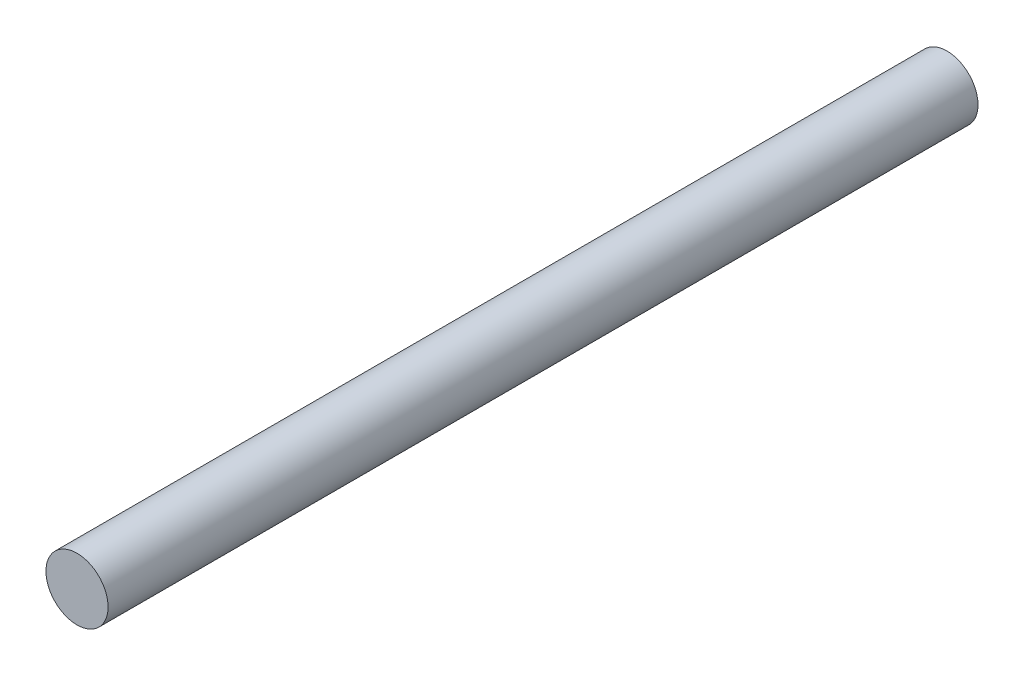
ISO-10303-21;
HEADER;
FILE_DESCRIPTION(('STEP AP214'),'2;1');
FILE_NAME('part.step','',(''),(''),'','','');
FILE_SCHEMA(('AUTOMOTIVE_DESIGN { 1 0 10303 214 1 1 1 1 }'));
ENDSEC;
DATA;
#1=APPLICATION_CONTEXT('core data for automotive mechanical design processes');
#2=APPLICATION_PROTOCOL_DEFINITION('international standard','automotive_design',2000,#1);
#3=PRODUCT_CONTEXT('',#1,'mechanical');
#4=PRODUCT('Part','Part','',(#3));
#5=PRODUCT_RELATED_PRODUCT_CATEGORY('part','',(#4));
#6=PRODUCT_DEFINITION_FORMATION('','',#4);
#7=PRODUCT_DEFINITION_CONTEXT('part definition',#1,'design');
#8=PRODUCT_DEFINITION('design','',#6,#7);
#9=PRODUCT_DEFINITION_SHAPE('','',#8);
#10=(LENGTH_UNIT() NAMED_UNIT(*) SI_UNIT(.MILLI.,.METRE.));
#11=(NAMED_UNIT(*) PLANE_ANGLE_UNIT() SI_UNIT($,.RADIAN.));
#12=(NAMED_UNIT(*) SI_UNIT($,.STERADIAN.) SOLID_ANGLE_UNIT());
#13=UNCERTAINTY_MEASURE_WITH_UNIT(LENGTH_MEASURE(1.E-05),#10,'distance_accuracy_value','');
#14=(GEOMETRIC_REPRESENTATION_CONTEXT(3) GLOBAL_UNCERTAINTY_ASSIGNED_CONTEXT((#13)) GLOBAL_UNIT_ASSIGNED_CONTEXT((#10,
#11,#12)) REPRESENTATION_CONTEXT('',''));
#15=CARTESIAN_POINT('',(0.,0.,0.));
#16=DIRECTION('',(0.,0.,1.));
#17=DIRECTION('',(1.,0.,0.));
#18=AXIS2_PLACEMENT_3D('',#15,#16,#17);
#19=CARTESIAN_POINT('',(0.,0.,355.6));
#20=DIRECTION('',(0.,0.,-1.));
#21=DIRECTION('',(-1.,0.,0.));
#22=AXIS2_PLACEMENT_3D('',#19,#20,#21);
#23=CYLINDRICAL_SURFACE('',#22,12.7);
#24=CARTESIAN_POINT('',(0.,0.,355.6));
#25=DIRECTION('',(0.,0.,1.));
#26=DIRECTION('',(1.,0.,0.));
#27=AXIS2_PLACEMENT_3D('',#24,#25,#26);
#28=CIRCLE('',#27,12.7);
#29=CARTESIAN_POINT('',(12.7,0.,355.6));
#30=VERTEX_POINT('',#29);
#31=EDGE_CURVE('E10',#30,#30,#28,.T.);
#32=ORIENTED_EDGE('',*,*,#31,.F.);
#33=EDGE_LOOP('',(#32));
#34=FACE_BOUND('',#33,.T.);
#35=CARTESIAN_POINT('',(0.,0.,0.));
#36=DIRECTION('',(0.,0.,1.));
#37=DIRECTION('',(1.,0.,0.));
#38=AXIS2_PLACEMENT_3D('',#35,#36,#37);
#39=CIRCLE('',#38,12.7);
#40=CARTESIAN_POINT('',(12.7,0.,0.));
#41=VERTEX_POINT('',#40);
#42=EDGE_CURVE('E35',#41,#41,#39,.T.);
#43=ORIENTED_EDGE('',*,*,#42,.T.);
#44=EDGE_LOOP('',(#43));
#45=FACE_BOUND('',#44,.T.);
#46=ADVANCED_FACE('F32',(#34,#45),#23,.T.);
#47=CARTESIAN_POINT('',(0.,0.,355.6));
#48=DIRECTION('',(0.,0.,1.));
#49=DIRECTION('',(1.,0.,0.));
#50=AXIS2_PLACEMENT_3D('',#47,#48,#49);
#51=PLANE('',#50);
#52=ORIENTED_EDGE('',*,*,#31,.T.);
#53=EDGE_LOOP('',(#52));
#54=FACE_BOUND('',#53,.T.);
#55=ADVANCED_FACE('F47',(#54),#51,.T.);
#56=CARTESIAN_POINT('',(0.,0.,0.));
#57=DIRECTION('',(0.,0.,1.));
#58=DIRECTION('',(1.,0.,0.));
#59=AXIS2_PLACEMENT_3D('',#56,#57,#58);
#60=PLANE('',#59);
#61=ORIENTED_EDGE('',*,*,#42,.F.);
#62=EDGE_LOOP('',(#61));
#63=FACE_BOUND('',#62,.T.);
#64=ADVANCED_FACE('F45',(#63),#60,.F.);
#65=CLOSED_SHELL('',(#46,#55,#64));
#66=MANIFOLD_SOLID_BREP('B2',#65);
#67=ADVANCED_BREP_SHAPE_REPRESENTATION('',(#18,#66),#14);
#68=SHAPE_DEFINITION_REPRESENTATION(#9,#67);
ENDSEC;
END-ISO-10303-21;
